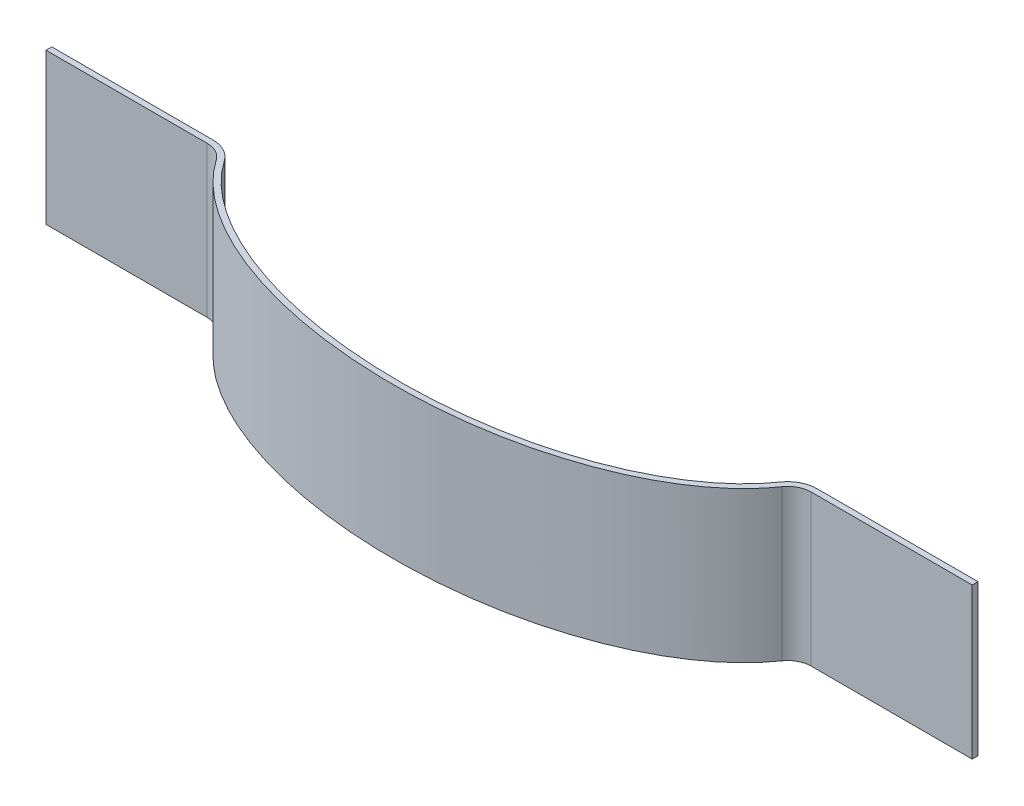
ISO-10303-21;
HEADER;
FILE_DESCRIPTION(('STEP AP214'),'2;1');
FILE_NAME('part.step','',(''),(''),'','','');
FILE_SCHEMA(('AUTOMOTIVE_DESIGN { 1 0 10303 214 1 1 1 1 }'));
ENDSEC;
DATA;
#1=APPLICATION_CONTEXT('core data for automotive mechanical design processes');
#2=APPLICATION_PROTOCOL_DEFINITION('international standard','automotive_design',2000,#1);
#3=PRODUCT_CONTEXT('',#1,'mechanical');
#4=PRODUCT('Part','Part','',(#3));
#5=PRODUCT_RELATED_PRODUCT_CATEGORY('part','',(#4));
#6=PRODUCT_DEFINITION_FORMATION('','',#4);
#7=PRODUCT_DEFINITION_CONTEXT('part definition',#1,'design');
#8=PRODUCT_DEFINITION('design','',#6,#7);
#9=PRODUCT_DEFINITION_SHAPE('','',#8);
#10=(LENGTH_UNIT() NAMED_UNIT(*) SI_UNIT(.MILLI.,.METRE.));
#11=(NAMED_UNIT(*) PLANE_ANGLE_UNIT() SI_UNIT($,.RADIAN.));
#12=(NAMED_UNIT(*) SI_UNIT($,.STERADIAN.) SOLID_ANGLE_UNIT());
#13=UNCERTAINTY_MEASURE_WITH_UNIT(LENGTH_MEASURE(1.E-05),#10,'distance_accuracy_value','');
#14=(GEOMETRIC_REPRESENTATION_CONTEXT(3) GLOBAL_UNCERTAINTY_ASSIGNED_CONTEXT((#13)) GLOBAL_UNIT_ASSIGNED_CONTEXT((#10,
#11,#12)) REPRESENTATION_CONTEXT('',''));
#15=CARTESIAN_POINT('',(0.,0.,0.));
#16=DIRECTION('',(0.,0.,1.));
#17=DIRECTION('',(1.,0.,0.));
#18=AXIS2_PLACEMENT_3D('',#15,#16,#17);
#19=CARTESIAN_POINT('',(16.8897912138371,9.49999999497035,10.9999999950296));
#20=DIRECTION('',(0.,1.,0.));
#21=DIRECTION('',(-1.,0.,0.));
#22=AXIS2_PLACEMENT_3D('',#19,#20,#21);
#23=CYLINDRICAL_SURFACE('',#22,2.);
#24=DIRECTION('',(0.,-1.,0.));
#25=VECTOR('',#24,1.);
#26=CARTESIAN_POINT('',(16.8897912138371,-5.02963642956544E-09,8.99999999502961));
#27=LINE('',#26,#25);
#28=CARTESIAN_POINT('',(16.8897912138371,15.9999999949704,8.99999999502967));
#29=VERTEX_POINT('',#28);
#30=CARTESIAN_POINT('',(16.8897912138371,2.99999999999999,8.99999999502961));
#31=VERTEX_POINT('',#30);
#32=EDGE_CURVE('E223',#29,#31,#27,.T.);
#33=ORIENTED_EDGE('',*,*,#32,.T.);
#34=CARTESIAN_POINT('',(16.8897912138371,2.99999999999999,10.9999999950296));
#35=DIRECTION('',(0.,1.,0.));
#36=DIRECTION('',(-1.,0.,0.));
#37=AXIS2_PLACEMENT_3D('',#34,#35,#36);
#38=CIRCLE('',#37,2.);
#39=CARTESIAN_POINT('',(18.5374581917324,2.99999999999999,9.86633623096491));
#40=VERTEX_POINT('',#39);
#41=EDGE_CURVE('E225',#31,#40,#38,.F.);
#42=ORIENTED_EDGE('',*,*,#41,.T.);
#43=DIRECTION('',(0.,1.,0.));
#44=VECTOR('',#43,1.);
#45=CARTESIAN_POINT('',(18.5374581917217,-5.02965030735325E-09,9.86633623094938));
#46=LINE('',#45,#44);
#47=CARTESIAN_POINT('',(18.5374581917324,15.9999999949704,9.86633623096492));
#48=VERTEX_POINT('',#47);
#49=EDGE_CURVE('E233',#40,#48,#46,.T.);
#50=ORIENTED_EDGE('',*,*,#49,.T.);
#51=CARTESIAN_POINT('',(16.8897912138371,15.9999999949704,10.9999999950297));
#52=DIRECTION('',(0.,-1.,0.));
#53=DIRECTION('',(1.,0.,0.));
#54=AXIS2_PLACEMENT_3D('',#51,#52,#53);
#55=CIRCLE('',#54,2.);
#56=EDGE_CURVE('E227',#48,#29,#55,.F.);
#57=ORIENTED_EDGE('',*,*,#56,.T.);
#58=EDGE_LOOP('',(#33,#42,#50,#57));
#59=FACE_BOUND('',#58,.T.);
#60=ADVANCED_FACE('F36',(#59),#23,.F.);
#61=CARTESIAN_POINT('',(20.91618604,-5.02963642956544E-09,8.99999999502961));
#62=DIRECTION('',(0.,0.,1.));
#63=DIRECTION('',(-1.,0.,0.));
#64=AXIS2_PLACEMENT_3D('',#61,#62,#63);
#65=PLANE('',#64);
#66=DIRECTION('',(-1.,0.,0.));
#67=VECTOR('',#66,1.);
#68=CARTESIAN_POINT('',(20.91618604,2.99999999999999,8.99999999502962));
#69=LINE('',#68,#67);
#70=CARTESIAN_POINT('',(3.,2.99999999999999,8.99999999502964));
#71=VERTEX_POINT('',#70);
#72=EDGE_CURVE('E205',#31,#71,#69,.T.);
#73=ORIENTED_EDGE('',*,*,#72,.F.);
#74=ORIENTED_EDGE('',*,*,#32,.F.);
#75=DIRECTION('',(1.,0.,0.));
#76=VECTOR('',#75,1.);
#77=CARTESIAN_POINT('',(20.91618604,15.9999999949704,8.99999999502967));
#78=LINE('',#77,#76);
#79=CARTESIAN_POINT('',(3.,15.9999999949704,8.99999999502964));
#80=VERTEX_POINT('',#79);
#81=EDGE_CURVE('E58',#80,#29,#78,.T.);
#82=ORIENTED_EDGE('',*,*,#81,.F.);
#83=DIRECTION('',(0.,1.,0.));
#84=VECTOR('',#83,1.);
#85=CARTESIAN_POINT('',(3.,-5.02963523419511E-09,8.99999999502961));
#86=LINE('',#85,#84);
#87=EDGE_CURVE('E43',#71,#80,#86,.T.);
#88=ORIENTED_EDGE('',*,*,#87,.F.);
#89=EDGE_LOOP('',(#73,#74,#82,#88));
#90=FACE_BOUND('',#89,.T.);
#91=ADVANCED_FACE('F213',(#90),#65,.T.);
#92=CARTESIAN_POINT('',(68.9425808661629,9.49999999497035,10.9999999950296));
#93=DIRECTION('',(0.,1.,0.));
#94=DIRECTION('',(-1.,0.,0.));
#95=AXIS2_PLACEMENT_3D('',#92,#93,#94);
#96=CYLINDRICAL_SURFACE('',#95,2.);
#97=DIRECTION('',(0.,1.,0.));
#98=VECTOR('',#97,1.);
#99=CARTESIAN_POINT('',(67.294913888276,-5.02964336845935E-09,9.86633623095261));
#100=LINE('',#99,#98);
#101=CARTESIAN_POINT('',(67.2949138882676,15.9999999949703,9.86633623096491));
#102=VERTEX_POINT('',#101);
#103=CARTESIAN_POINT('',(67.2949138882676,3.,9.86633623096487));
#104=VERTEX_POINT('',#103);
#105=EDGE_CURVE('E229',#102,#104,#100,.F.);
#106=ORIENTED_EDGE('',*,*,#105,.T.);
#107=CARTESIAN_POINT('',(68.9425808661629,3.,10.9999999950296));
#108=DIRECTION('',(0.,1.,0.));
#109=DIRECTION('',(-1.,0.,0.));
#110=AXIS2_PLACEMENT_3D('',#107,#108,#109);
#111=CIRCLE('',#110,2.);
#112=CARTESIAN_POINT('',(68.9425808661629,3.,8.99999999502959));
#113=VERTEX_POINT('',#112);
#114=EDGE_CURVE('E204',#104,#113,#111,.F.);
#115=ORIENTED_EDGE('',*,*,#114,.T.);
#116=DIRECTION('',(0.,-1.,0.));
#117=VECTOR('',#116,1.);
#118=CARTESIAN_POINT('',(68.9425808661629,-5.02963642956544E-09,8.99999999502962));
#119=LINE('',#118,#117);
#120=CARTESIAN_POINT('',(68.9425808661629,15.9999999949703,8.99999999502963));
#121=VERTEX_POINT('',#120);
#122=EDGE_CURVE('E236',#113,#121,#119,.F.);
#123=ORIENTED_EDGE('',*,*,#122,.T.);
#124=CARTESIAN_POINT('',(68.9425808661629,15.9999999949703,10.9999999950296));
#125=DIRECTION('',(0.,-1.,0.));
#126=DIRECTION('',(1.,0.,0.));
#127=AXIS2_PLACEMENT_3D('',#124,#125,#126);
#128=CIRCLE('',#127,2.);
#129=EDGE_CURVE('E183',#121,#102,#128,.F.);
#130=ORIENTED_EDGE('',*,*,#129,.T.);
#131=EDGE_LOOP('',(#106,#115,#123,#130));
#132=FACE_BOUND('',#131,.T.);
#133=ADVANCED_FACE('F218',(#132),#96,.F.);
#134=CARTESIAN_POINT('',(64.91618604,-5.02963642956544E-09,8.99999999502962));
#135=DIRECTION('',(0.,0.,1.));
#136=DIRECTION('',(-1.,0.,0.));
#137=AXIS2_PLACEMENT_3D('',#134,#135,#136);
#138=PLANE('',#137);
#139=DIRECTION('',(-1.,0.,0.));
#140=VECTOR('',#139,1.);
#141=CARTESIAN_POINT('',(64.91618604,3.,8.99999999502963));
#142=LINE('',#141,#140);
#143=CARTESIAN_POINT('',(82.8323720749977,3.,8.99999999502965));
#144=VERTEX_POINT('',#143);
#145=EDGE_CURVE('E297',#144,#113,#142,.T.);
#146=ORIENTED_EDGE('',*,*,#145,.F.);
#147=DIRECTION('',(0.,-1.,0.));
#148=VECTOR('',#147,1.);
#149=CARTESIAN_POINT('',(82.8323720749977,-5.02963642956544E-09,8.99999999502961));
#150=LINE('',#149,#148);
#151=CARTESIAN_POINT('',(82.8323720749977,15.9999999949704,8.99999999502967));
#152=VERTEX_POINT('',#151);
#153=EDGE_CURVE('E11',#152,#144,#150,.T.);
#154=ORIENTED_EDGE('',*,*,#153,.F.);
#155=DIRECTION('',(1.,0.,0.));
#156=VECTOR('',#155,1.);
#157=CARTESIAN_POINT('',(64.91618604,15.9999999949703,8.99999999502967));
#158=LINE('',#157,#156);
#159=EDGE_CURVE('E285',#121,#152,#158,.T.);
#160=ORIENTED_EDGE('',*,*,#159,.F.);
#161=ORIENTED_EDGE('',*,*,#122,.F.);
#162=EDGE_LOOP('',(#146,#154,#160,#161));
#163=FACE_BOUND('',#162,.T.);
#164=ADVANCED_FACE('F191',(#163),#138,.T.);
#165=CARTESIAN_POINT('',(20.91618604,-5.02962255177763E-09,4.99999999502961));
#166=CARTESIAN_POINT('',(20.91618604,-5.02962255177763E-09,5.43203663686933));
#167=CARTESIAN_POINT('',(21.0612996780334,-5.02962255177763E-09,6.29610992054875));
#168=CARTESIAN_POINT('',(21.9187981969256,-5.02963642956544E-09,7.88664464208802));
#169=CARTESIAN_POINT('',(23.6581810932833,-5.02964336845935E-09,9.6693867916077));
#170=CARTESIAN_POINT('',(27.1749338723224,-5.02965030735325E-09,11.9987857519427));
#171=CARTESIAN_POINT('',(33.5518250020295,-5.02965724624715E-09,14.3281522537659));
#172=CARTESIAN_POINT('',(42.91618604,-5.02966418514106E-09,15.3359238656615));
#173=CARTESIAN_POINT('',(52.2805470779705,-5.02966418514106E-09,14.3281522537659));
#174=CARTESIAN_POINT('',(58.6574382076776,-5.02965030735325E-09,11.9987857519427));
#175=CARTESIAN_POINT('',(62.1741909867167,-5.02963642956544E-09,9.6693867916077));
#176=CARTESIAN_POINT('',(63.9135738830744,-5.02963642956544E-09,7.88664464208802));
#177=CARTESIAN_POINT('',(64.7710724019666,-5.02962255177763E-09,6.29610992054875));
#178=CARTESIAN_POINT('',(64.91618604,-5.02962255177763E-09,5.43203663686933));
#179=CARTESIAN_POINT('',(64.91618604,-5.02962255177763E-09,4.99999999502962));
#180=B_SPLINE_CURVE_WITH_KNOTS('',3,(#165,#166,#167,#168,#169,#170,#171,#172,#173,#174,#175,
#176,#177,#178,#179),.UNSPECIFIED.,.F.,.F.,(4,1,1,1,1,1,1,1,1,1,1,1,4),(3.14159265358979,
3.33794219443916,3.53429173528852,3.73064127613788,3.92699081698724,4.31968989868597,
4.71238898038469,5.10508806208341,5.49778714378214,5.6941366846315,5.89048622548086,
6.08683576633022,6.28318530717959),.UNSPECIFIED.);
#181=DIRECTION('',(0.,1.,0.));
#182=VECTOR('',#181,1.);
#183=SURFACE_OF_LINEAR_EXTRUSION('',#180,#182);
#184=OFFSET_SURFACE('',#183,4.,.F.);
#185=CARTESIAN_POINT('',(67.2949138882676,3.,9.86633623096487));
#186=CARTESIAN_POINT('',(67.1684440931066,3.,10.0502030135455));
#187=CARTESIAN_POINT('',(67.0363906796709,3.,10.2301440314707));
#188=CARTESIAN_POINT('',(66.7626468408219,3.,10.5820103308421));
#189=CARTESIAN_POINT('',(66.620974997312,3.,10.7539500441448));
#190=CARTESIAN_POINT('',(66.3291127520982,3.,11.0902550530924));
#191=CARTESIAN_POINT('',(66.1789266630438,3.,11.2546241083053));
#192=CARTESIAN_POINT('',(65.8724313172399,3.,11.5746100408212));
#193=CARTESIAN_POINT('',(65.7161921280537,3.,11.7302941816732));
#194=CARTESIAN_POINT('',(65.3970483231909,3.,12.0348203377828));
#195=CARTESIAN_POINT('',(65.2341405097192,3.,12.1836589960406));
#196=CARTESIAN_POINT('',(64.9023845100024,3.,12.4746420649206));
#197=CARTESIAN_POINT('',(64.7335345581745,3.,12.6167844560413));
#198=CARTESIAN_POINT('',(64.2514464556864,3.,13.0071405144468));
#199=CARTESIAN_POINT('',(63.9321481771395,3.,13.2479047347508));
#200=CARTESIAN_POINT('',(63.2795117624317,3.,13.7097134978813));
#201=CARTESIAN_POINT('',(62.9461676914851,3.,13.9307495794251));
#202=CARTESIAN_POINT('',(62.2679411757094,3.,14.3543866724914));
#203=CARTESIAN_POINT('',(61.9230574555743,3.,14.5569856371685));
#204=CARTESIAN_POINT('',(61.2210471929346,3.,14.9460497469424));
#205=CARTESIAN_POINT('',(60.8638496371084,3.,15.1323862668058));
#206=CARTESIAN_POINT('',(60.1414727278882,3.,15.4886168930814));
#207=CARTESIAN_POINT('',(59.776295065123,3.,15.6585144415647));
#208=CARTESIAN_POINT('',(59.0392700343087,3.,15.9832339756128));
#209=CARTESIAN_POINT('',(58.6674218096528,3.,16.1380540083331));
#210=CARTESIAN_POINT('',(57.7995477412056,3.,16.4803684463789));
#211=CARTESIAN_POINT('',(57.3014785566919,3.,16.6626897441269));
#212=CARTESIAN_POINT('',(56.2975311155487,3.,17.0045725848523));
#213=CARTESIAN_POINT('',(55.7916513731083,3.,17.1641297367609));
#214=CARTESIAN_POINT('',(54.7733151560886,3.,17.4616716407113));
#215=CARTESIAN_POINT('',(54.2608555736741,3.,17.5996457600311));
#216=CARTESIAN_POINT('',(53.4883395046693,3.,17.7909046867859));
#217=CARTESIAN_POINT('',(53.2301992293896,3.,17.8520400335823));
#218=CARTESIAN_POINT('',(52.7127456594417,3.,17.9691327831594));
#219=CARTESIAN_POINT('',(52.4534323617423,3.,18.0250901725522));
#220=CARTESIAN_POINT('',(51.6740585073555,3.,18.1854080267874));
#221=CARTESIAN_POINT('',(51.1524350318748,3.,18.28224593991));
#222=CARTESIAN_POINT('',(50.1060220544663,3.,18.4569080901237));
#223=CARTESIAN_POINT('',(49.5812324335895,3.,18.5347316082456));
#224=CARTESIAN_POINT('',(48.5293945254812,3.,18.6720785690793));
#225=CARTESIAN_POINT('',(48.0023467968509,3.,18.7316062995037));
#226=CARTESIAN_POINT('',(46.9465469458277,3.,18.8328564322404));
#227=CARTESIAN_POINT('',(46.417794836107,3.,18.8745789666297));
#228=CARTESIAN_POINT('',(45.5109740706491,3.,18.9309977924382));
#229=CARTESIAN_POINT('',(45.1331678550092,3.,18.9500130778416));
#230=CARTESIAN_POINT('',(44.3772180544103,3.,18.9791119253451));
#231=CARTESIAN_POINT('',(43.9990744785194,3.,18.9891957206831));
#232=CARTESIAN_POINT('',(43.2426266175703,3.,19.000374274344));
#233=CARTESIAN_POINT('',(42.8643223226806,3.,19.0014683665954));
#234=CARTESIAN_POINT('',(42.1077931008588,3.,18.9946425532552));
#235=CARTESIAN_POINT('',(41.7295681745753,3.,18.9867225766493));
#236=CARTESIAN_POINT('',(40.9733081320334,3.,18.9619440114931));
#237=CARTESIAN_POINT('',(40.5952730923841,3.,18.9450830605258));
#238=CARTESIAN_POINT('',(39.8397210572341,3.,18.9024129697075));
#239=CARTESIAN_POINT('',(39.4622040612316,3.,18.8766038385317));
#240=CARTESIAN_POINT('',(38.3322142249044,3.,18.7858088329513));
#241=CARTESIAN_POINT('',(37.5807477058313,3.,18.7074046774618));
#242=CARTESIAN_POINT('',(36.4573039340414,3.,18.5620741999557));
#243=CARTESIAN_POINT('',(36.0834720531697,3.,18.5090142055376));
#244=CARTESIAN_POINT('',(35.337266261916,3.,18.3933823845907));
#245=CARTESIAN_POINT('',(34.9648923580415,3.,18.3308105156573));
#246=CARTESIAN_POINT('',(34.2220947907623,3.,18.1958780133701));
#247=CARTESIAN_POINT('',(33.8516703253949,2.99999999999999,18.1235217961705));
#248=CARTESIAN_POINT('',(33.1129730195451,2.99999999999999,17.9685575512248));
#249=CARTESIAN_POINT('',(32.7447001364086,2.99999999999999,17.8859497274393));
#250=CARTESIAN_POINT('',(32.0686314967826,2.99999999999999,17.7240461221481));
#251=CARTESIAN_POINT('',(31.7604675275647,2.99999999999999,17.6462866528733));
#252=CARTESIAN_POINT('',(31.1461648461952,2.99999999999999,17.4831656550781));
#253=CARTESIAN_POINT('',(30.8400261260857,2.99999999999999,17.3978041564476));
#254=CARTESIAN_POINT('',(29.9250030969704,2.99999999999999,17.1300491601522));
#255=CARTESIAN_POINT('',(29.3194857725492,2.99999999999999,16.9359789373812));
#256=CARTESIAN_POINT('',(28.1193664685582,2.99999999999999,16.5144629301057));
#257=CARTESIAN_POINT('',(27.5247766758037,2.99999999999999,16.2869821580386));
#258=CARTESIAN_POINT('',(26.6444219391632,2.99999999999999,15.9184749630105));
#259=CARTESIAN_POINT('',(26.3529043883624,2.99999999999999,15.7910976627161));
#260=CARTESIAN_POINT('',(25.7742809160311,2.99999999999999,15.5266732937783));
#261=CARTESIAN_POINT('',(25.4871747874601,2.99999999999999,15.3896266806417));
#262=CARTESIAN_POINT('',(24.986079454977,2.99999999999999,15.1391845810809));
#263=CARTESIAN_POINT('',(24.7710047073359,2.99999999999999,15.0279579324538));
#264=CARTESIAN_POINT('',(24.3442429945969,2.99999999999999,14.7991804642747));
#265=CARTESIAN_POINT('',(24.1325559720853,2.99999999999999,14.681629752048));
#266=CARTESIAN_POINT('',(23.7128984861939,2.99999999999999,14.4399850157551));
#267=CARTESIAN_POINT('',(23.5049286546783,2.99999999999999,14.3158898931417));
#268=CARTESIAN_POINT('',(23.0931650592438,2.99999999999999,14.0609468096725));
#269=CARTESIAN_POINT('',(22.8893713121394,2.99999999999999,13.9300988216346));
#270=CARTESIAN_POINT('',(22.4874086234861,2.99999999999999,13.6620019360083));
#271=CARTESIAN_POINT('',(22.2892176950368,2.99999999999999,13.524786120459));
#272=CARTESIAN_POINT('',(21.8980811661594,2.99999999999999,13.2430954268313));
#273=CARTESIAN_POINT('',(21.7051357015843,2.99999999999999,13.0986203610198));
#274=CARTESIAN_POINT('',(21.1354199303817,2.99999999999999,12.6537953527266));
#275=CARTESIAN_POINT('',(20.767475547945,2.99999999999999,12.3418515561697));
#276=CARTESIAN_POINT('',(20.2409300098414,2.99999999999999,11.8517608390854));
#277=CARTESIAN_POINT('',(20.0707403664345,2.99999999999999,11.6859289569286));
#278=CARTESIAN_POINT('',(19.738792765326,2.99999999999999,11.346097215661));
#279=CARTESIAN_POINT('',(19.5770319678337,2.99999999999999,11.1721001455553));
#280=CARTESIAN_POINT('',(19.2623123002156,2.99999999999999,10.8147341263391));
#281=CARTESIAN_POINT('',(19.1094014988301,2.99999999999999,10.6313226567127));
#282=CARTESIAN_POINT('',(18.8146771516958,2.99999999999999,10.2555603950001));
#283=CARTESIAN_POINT('',(18.6728729416345,2.99999999999999,10.0632022947002));
#284=CARTESIAN_POINT('',(18.5374581917324,2.99999999999999,9.86633623096489));
#285=B_SPLINE_CURVE_WITH_KNOTS('',3,(#185,#186,#187,#188,#189,#190,#191,#192,#193,#194,#195,
#196,#197,#198,#199,#200,#201,#202,#203,#204,#205,#206,#207,#208,#209,#210,#211,#212,#213,#214,
#215,#216,#217,#218,#219,#220,#221,#222,#223,#224,#225,#226,#227,#228,#229,#230,#231,#232,#233,
#234,#235,#236,#237,#238,#239,#240,#241,#242,#243,#244,#245,#246,#247,#248,#249,#250,#251,#252,
#253,#254,#255,#256,#257,#258,#259,#260,#261,#262,#263,#264,#265,#266,#267,#268,#269,#270,#271,
#272,#273,#274,#275,#276,#277,#278,#279,#280,#281,#282,#283,#284),.UNSPECIFIED.,.F.,.F.,(4,2,2,
2,2,2,2,2,2,2,2,2,2,2,2,2,2,2,2,2,2,2,2,2,2,2,2,2,2,2,2,2,2,2,2,2,2,2,2,2,2,2,2,2,2,2,2,2,2,4),
(0.,0.669281806984418,1.33730552325058,2.00499384289205,2.66646274120828,3.32825263621456,
3.99024085666846,5.18901225671086,6.38829535658677,7.58771143603576,8.79588651027868,
10.003808061059,11.211885854719,12.8024289014461,14.3932783408854,15.9849090490023,
16.7807068771558,17.5765067628298,19.1677083788796,20.7589701518634,22.349858719549,
23.9407354859981,25.0754911165634,26.210217113122,27.3450271838467,28.4798461948418,
29.6149652014029,30.7500831074906,33.0156563363389,34.1483005989663,35.2809499111618,
36.4130896992206,37.5452069664283,38.4985792432365,39.4519477717131,41.3586042894407,
43.2672718873329,44.2215230770731,45.1757293434572,45.9020350132949,46.6283283609372,
47.3547440149406,48.0811625931855,48.8041567891258,49.5271696922066,50.9721395653798,
51.6847852079455,52.3971891772918,53.1131561977558,53.8297187086723),.UNSPECIFIED.);
#286=EDGE_CURVE('E198',#104,#40,#285,.T.);
#287=ORIENTED_EDGE('',*,*,#286,.F.);
#288=ORIENTED_EDGE('',*,*,#105,.F.);
#289=CARTESIAN_POINT('',(18.5374581917324,15.9999999949704,9.86633623096493));
#290=CARTESIAN_POINT('',(18.6639279868934,15.9999999949704,10.0502030135455));
#291=CARTESIAN_POINT('',(18.7959814003291,15.9999999949704,10.2301440314708));
#292=CARTESIAN_POINT('',(19.0697252391781,15.9999999949704,10.5820103308422));
#293=CARTESIAN_POINT('',(19.211397082688,15.9999999949704,10.7539500441449));
#294=CARTESIAN_POINT('',(19.5032593279019,15.9999999949704,11.0902550530925));
#295=CARTESIAN_POINT('',(19.6534454169562,15.9999999949704,11.2546241083054));
#296=CARTESIAN_POINT('',(19.9599407627601,15.9999999949704,11.5746100408213));
#297=CARTESIAN_POINT('',(20.1161799519464,15.9999999949704,11.7302941816733));
#298=CARTESIAN_POINT('',(20.4353237568092,15.9999999949704,12.0348203377829));
#299=CARTESIAN_POINT('',(20.5982315702808,15.9999999949704,12.1836589960407));
#300=CARTESIAN_POINT('',(20.9299875699977,15.9999999949704,12.4746420649207));
#301=CARTESIAN_POINT('',(21.0988375218255,15.9999999949704,12.6167844560414));
#302=CARTESIAN_POINT('',(21.5809256243136,15.9999999949704,13.0071405144469));
#303=CARTESIAN_POINT('',(21.9002239028605,15.9999999949704,13.2479047347509));
#304=CARTESIAN_POINT('',(22.5528603175683,15.9999999949704,13.7097134978814));
#305=CARTESIAN_POINT('',(22.8862043885149,15.9999999949704,13.9307495794252));
#306=CARTESIAN_POINT('',(23.5644309042907,15.9999999949704,14.3543866724915));
#307=CARTESIAN_POINT('',(23.9093146244258,15.9999999949704,14.5569856371686));
#308=CARTESIAN_POINT('',(24.6113248870654,15.9999999949704,14.9460497469425));
#309=CARTESIAN_POINT('',(24.9685224428917,15.9999999949704,15.1323862668059));
#310=CARTESIAN_POINT('',(25.6908993521119,15.9999999949704,15.4886168930815));
#311=CARTESIAN_POINT('',(26.0560770148771,15.9999999949704,15.6585144415648));
#312=CARTESIAN_POINT('',(26.7931020456914,15.9999999949704,15.9832339756129));
#313=CARTESIAN_POINT('',(27.1649502703472,15.9999999949704,16.1380540083331));
#314=CARTESIAN_POINT('',(28.0328243387945,15.9999999949704,16.480368446379));
#315=CARTESIAN_POINT('',(28.5308935233082,15.9999999949704,16.662689744127));
#316=CARTESIAN_POINT('',(29.5348409644515,15.9999999949704,17.0045725848524));
#317=CARTESIAN_POINT('',(30.0407207068918,15.9999999949704,17.164129736761));
#318=CARTESIAN_POINT('',(31.0590569239116,15.9999999949704,17.4616716407113));
#319=CARTESIAN_POINT('',(31.571516506326,15.9999999949704,17.5996457600312));
#320=CARTESIAN_POINT('',(32.3440325753309,15.9999999949704,17.790904686786));
#321=CARTESIAN_POINT('',(32.6021728506105,15.9999999949704,17.8520400335823));
#322=CARTESIAN_POINT('',(33.1196264205585,15.9999999949704,17.9691327831594));
#323=CARTESIAN_POINT('',(33.3789397182578,15.9999999949704,18.0250901725523));
#324=CARTESIAN_POINT('',(34.1583135726446,15.9999999949704,18.1854080267875));
#325=CARTESIAN_POINT('',(34.6799370481254,15.9999999949704,18.2822459399101));
#326=CARTESIAN_POINT('',(35.7263500255338,15.9999999949704,18.4569080901238));
#327=CARTESIAN_POINT('',(36.2511396464107,15.9999999949704,18.5347316082457));
#328=CARTESIAN_POINT('',(37.302977554519,15.9999999949704,18.6720785690793));
#329=CARTESIAN_POINT('',(37.8300252831492,15.9999999949704,18.7316062995037));
#330=CARTESIAN_POINT('',(38.8858251341724,15.9999999949704,18.8328564322405));
#331=CARTESIAN_POINT('',(39.4145772438932,15.9999999949704,18.8745789666298));
#332=CARTESIAN_POINT('',(40.3213980093511,15.9999999949704,18.9309977924382));
#333=CARTESIAN_POINT('',(40.699204224991,15.9999999949704,18.9500130778417));
#334=CARTESIAN_POINT('',(41.4551540255898,15.9999999949704,18.9791119253451));
#335=CARTESIAN_POINT('',(41.8332976014808,15.9999999949704,18.9891957206831));
#336=CARTESIAN_POINT('',(42.5897454624299,15.9999999949704,19.000374274344));
#337=CARTESIAN_POINT('',(42.9680497573195,15.9999999949704,19.0014683665955));
#338=CARTESIAN_POINT('',(43.7245789791414,15.9999999949704,18.9946425532552));
#339=CARTESIAN_POINT('',(44.1028039054249,15.9999999949704,18.9867225766493));
#340=CARTESIAN_POINT('',(44.8590639479668,15.9999999949704,18.9619440114932));
#341=CARTESIAN_POINT('',(45.2370989876162,15.9999999949704,18.9450830605258));
#342=CARTESIAN_POINT('',(45.9926510227661,15.9999999949704,18.9024129697075));
#343=CARTESIAN_POINT('',(46.3701680187686,15.9999999949704,18.8766038385317));
#344=CARTESIAN_POINT('',(47.5001578550959,15.9999999949704,18.7858088329513));
#345=CARTESIAN_POINT('',(48.251624374169,15.9999999949704,18.7074046774618));
#346=CARTESIAN_POINT('',(49.3750681459588,15.9999999949704,18.5620741999557));
#347=CARTESIAN_POINT('',(49.7489000268305,15.9999999949704,18.5090142055376));
#348=CARTESIAN_POINT('',(50.4951058180842,15.9999999949704,18.3933823845907));
#349=CARTESIAN_POINT('',(50.8674797219588,15.9999999949704,18.3308105156573));
#350=CARTESIAN_POINT('',(51.6102772892379,15.9999999949704,18.1958780133701));
#351=CARTESIAN_POINT('',(51.9807017546054,15.9999999949704,18.1235217961705));
#352=CARTESIAN_POINT('',(52.7193990604552,15.9999999949704,17.9685575512247));
#353=CARTESIAN_POINT('',(53.0876719435916,15.9999999949704,17.8859497274392));
#354=CARTESIAN_POINT('',(53.7637405832177,15.9999999949704,17.7240461221481));
#355=CARTESIAN_POINT('',(54.0719045524356,15.9999999949704,17.6462866528732));
#356=CARTESIAN_POINT('',(54.6862072338051,15.9999999949704,17.483165655078));
#357=CARTESIAN_POINT('',(54.9923459539146,15.9999999949703,17.3978041564475));
#358=CARTESIAN_POINT('',(55.9073689830299,15.9999999949703,17.1300491601521));
#359=CARTESIAN_POINT('',(56.5128863074511,15.9999999949703,16.9359789373812));
#360=CARTESIAN_POINT('',(57.7130056114421,15.9999999949703,16.5144629301056));
#361=CARTESIAN_POINT('',(58.3075954041965,15.9999999949703,16.2869821580385));
#362=CARTESIAN_POINT('',(59.1879501408371,15.9999999949703,15.9184749630104));
#363=CARTESIAN_POINT('',(59.4794676916379,15.9999999949703,15.791097662716));
#364=CARTESIAN_POINT('',(60.0580911639692,15.9999999949703,15.5266732937782));
#365=CARTESIAN_POINT('',(60.3451972925402,15.9999999949703,15.3896266806416));
#366=CARTESIAN_POINT('',(60.8462926250233,15.9999999949703,15.1391845810808));
#367=CARTESIAN_POINT('',(61.0613673726644,15.9999999949703,15.0279579324537));
#368=CARTESIAN_POINT('',(61.4881290854034,15.9999999949703,14.7991804642746));
#369=CARTESIAN_POINT('',(61.699816107915,15.9999999949703,14.6816297520478));
#370=CARTESIAN_POINT('',(62.1194735938064,15.9999999949703,14.439985015755));
#371=CARTESIAN_POINT('',(62.3274434253219,15.9999999949703,14.3158898931415));
#372=CARTESIAN_POINT('',(62.7392070207564,15.9999999949703,14.0609468096723));
#373=CARTESIAN_POINT('',(62.9430007678608,15.9999999949703,13.9300988216345));
#374=CARTESIAN_POINT('',(63.3449634565141,15.9999999949703,13.6620019360082));
#375=CARTESIAN_POINT('',(63.5431543849634,15.9999999949703,13.5247861204589));
#376=CARTESIAN_POINT('',(63.9342909138408,15.9999999949703,13.2430954268311));
#377=CARTESIAN_POINT('',(64.1272363784159,15.9999999949703,13.0986203610196));
#378=CARTESIAN_POINT('',(64.6969521496185,15.9999999949703,12.6537953527265));
#379=CARTESIAN_POINT('',(65.0648965320551,15.9999999949703,12.3418515561695));
#380=CARTESIAN_POINT('',(65.5914420701588,15.9999999949703,11.8517608390852));
#381=CARTESIAN_POINT('',(65.7616317135656,15.9999999949703,11.6859289569285));
#382=CARTESIAN_POINT('',(66.0935793146741,15.9999999949703,11.3460972156609));
#383=CARTESIAN_POINT('',(66.2553401121664,15.9999999949703,11.1721001455552));
#384=CARTESIAN_POINT('',(66.5700597797844,15.9999999949703,10.814734126339));
#385=CARTESIAN_POINT('',(66.7229705811699,15.9999999949703,10.6313226567127));
#386=CARTESIAN_POINT('',(67.0176949283042,15.9999999949703,10.2555603950002));
#387=CARTESIAN_POINT('',(67.1594991383654,15.9999999949703,10.0632022947002));
#388=CARTESIAN_POINT('',(67.2949138882676,15.9999999949703,9.86633623096498));
#389=B_SPLINE_CURVE_WITH_KNOTS('',3,(#289,#290,#291,#292,#293,#294,#295,#296,#297,#298,#299,
#300,#301,#302,#303,#304,#305,#306,#307,#308,#309,#310,#311,#312,#313,#314,#315,#316,#317,#318,
#319,#320,#321,#322,#323,#324,#325,#326,#327,#328,#329,#330,#331,#332,#333,#334,#335,#336,#337,
#338,#339,#340,#341,#342,#343,#344,#345,#346,#347,#348,#349,#350,#351,#352,#353,#354,#355,#356,
#357,#358,#359,#360,#361,#362,#363,#364,#365,#366,#367,#368,#369,#370,#371,#372,#373,#374,#375,
#376,#377,#378,#379,#380,#381,#382,#383,#384,#385,#386,#387,#388),.UNSPECIFIED.,.F.,.F.,(4,2,2,
2,2,2,2,2,2,2,2,2,2,2,2,2,2,2,2,2,2,2,2,2,2,2,2,2,2,2,2,2,2,2,2,2,2,2,2,2,2,2,2,2,2,2,2,2,2,4),
(0.,0.66928180698443,1.33730552325061,2.00499384289208,2.66646274120832,3.32825263621462,
3.99024085666853,5.18901225671091,6.38829535658684,7.58771143603583,8.79588651027875,
10.0038080610591,11.2118858547191,12.8024289014462,14.3932783408855,15.9849090490024,
16.780706877156,17.5765067628299,19.1677083788798,20.7589701518636,22.3498587195491,
23.9407354859983,25.0754911165636,26.2102171131222,27.3450271838469,28.479846194842,
29.6149652014032,30.7500831074908,33.0156563363391,34.1483005989665,35.2809499111621,
36.4130896992208,37.5452069664286,38.4985792432368,39.4519477717134,41.358604289441,
43.2672718873332,44.2215230770734,45.1757293434575,45.9020350132952,46.6283283609375,
47.3547440149409,48.0811625931857,48.8041567891261,49.5271696922068,50.97213956538,
51.6847852079457,52.3971891772919,53.1131561977558,53.8297187086723),.UNSPECIFIED.);
#390=EDGE_CURVE('E176',#48,#102,#389,.T.);
#391=ORIENTED_EDGE('',*,*,#390,.F.);
#392=ORIENTED_EDGE('',*,*,#49,.F.);
#393=EDGE_LOOP('',(#287,#288,#391,#392));
#394=FACE_BOUND('',#393,.T.);
#395=ADVANCED_FACE('F186',(#394),#184,.T.);
#396=CARTESIAN_POINT('',(82.8323720749977,15.9999999949704,4.99999999502958));
#397=DIRECTION('',(-1.,0.,0.));
#398=DIRECTION('',(0.,0.,1.));
#399=AXIS2_PLACEMENT_3D('',#396,#397,#398);
#400=PLANE('',#399);
#401=DIRECTION('',(0.,0.,-1.));
#402=VECTOR('',#401,1.);
#403=CARTESIAN_POINT('',(82.8323720749977,3.,4.99999999502958));
#404=LINE('',#403,#402);
#405=CARTESIAN_POINT('',(82.8323720749977,3.,8.49999999502965));
#406=VERTEX_POINT('',#405);
#407=EDGE_CURVE('E251',#144,#406,#404,.T.);
#408=ORIENTED_EDGE('',*,*,#407,.T.);
#409=DIRECTION('',(0.,-1.,0.));
#410=VECTOR('',#409,1.);
#411=CARTESIAN_POINT('',(82.8323720749977,15.9999999949704,8.49999999502965));
#412=LINE('',#411,#410);
#413=CARTESIAN_POINT('',(82.8323720749977,15.9999999949704,8.49999999502965));
#414=VERTEX_POINT('',#413);
#415=EDGE_CURVE('E265',#414,#406,#412,.T.);
#416=ORIENTED_EDGE('',*,*,#415,.F.);
#417=DIRECTION('',(0.,0.,-1.));
#418=VECTOR('',#417,1.);
#419=CARTESIAN_POINT('',(82.8323720749977,15.9999999949704,4.99999999502958));
#420=LINE('',#419,#418);
#421=EDGE_CURVE('E249',#152,#414,#420,.T.);
#422=ORIENTED_EDGE('',*,*,#421,.F.);
#423=ORIENTED_EDGE('',*,*,#153,.T.);
#424=EDGE_LOOP('',(#408,#416,#422,#423));
#425=FACE_BOUND('',#424,.T.);
#426=ADVANCED_FACE('F169',(#425),#400,.F.);
#427=CARTESIAN_POINT('',(3.,2.99999999999999,4.99999999502958));
#428=DIRECTION('',(1.,0.,0.));
#429=DIRECTION('',(0.,1.,0.));
#430=AXIS2_PLACEMENT_3D('',#427,#428,#429);
#431=PLANE('',#430);
#432=DIRECTION('',(0.,0.,-1.));
#433=VECTOR('',#432,1.);
#434=CARTESIAN_POINT('',(3.,15.9999999949704,4.99999999502958));
#435=LINE('',#434,#433);
#436=CARTESIAN_POINT('',(3.,15.9999999949704,8.49999999502963));
#437=VERTEX_POINT('',#436);
#438=EDGE_CURVE('E243',#80,#437,#435,.T.);
#439=ORIENTED_EDGE('',*,*,#438,.T.);
#440=DIRECTION('',(0.,-1.,0.));
#441=VECTOR('',#440,1.);
#442=CARTESIAN_POINT('',(3.,15.9999999949704,8.49999999502963));
#443=LINE('',#442,#441);
#444=CARTESIAN_POINT('',(3.,2.99999999999999,8.49999999502963));
#445=VERTEX_POINT('',#444);
#446=EDGE_CURVE('E263',#437,#445,#443,.T.);
#447=ORIENTED_EDGE('',*,*,#446,.T.);
#448=DIRECTION('',(0.,0.,-1.));
#449=VECTOR('',#448,1.);
#450=CARTESIAN_POINT('',(3.,2.99999999999999,4.99999999502958));
#451=LINE('',#450,#449);
#452=EDGE_CURVE('E245',#71,#445,#451,.T.);
#453=ORIENTED_EDGE('',*,*,#452,.F.);
#454=ORIENTED_EDGE('',*,*,#87,.T.);
#455=EDGE_LOOP('',(#439,#447,#453,#454));
#456=FACE_BOUND('',#455,.T.);
#457=ADVANCED_FACE('F165',(#456),#431,.F.);
#458=CARTESIAN_POINT('',(82.8323720749977,3.,4.99999999502958));
#459=DIRECTION('',(0.,1.,0.));
#460=DIRECTION('',(-1.,0.,0.));
#461=AXIS2_PLACEMENT_3D('',#458,#459,#460);
#462=PLANE('',#461);
#463=CARTESIAN_POINT('',(68.9425808661629,3.,10.9999999950296));
#464=DIRECTION('',(0.,-1.,0.));
#465=DIRECTION('',(1.,0.,0.));
#466=AXIS2_PLACEMENT_3D('',#463,#464,#465);
#467=CIRCLE('',#466,2.5);
#468=CARTESIAN_POINT('',(66.8829971437937,3.,9.58292028994871));
#469=VERTEX_POINT('',#468);
#470=CARTESIAN_POINT('',(68.9425808661629,3.,8.49999999502959));
#471=VERTEX_POINT('',#470);
#472=EDGE_CURVE('E130',#469,#471,#467,.T.);
#473=ORIENTED_EDGE('',*,*,#472,.T.);
#474=DIRECTION('',(-1.,0.,0.));
#475=VECTOR('',#474,1.);
#476=CARTESIAN_POINT('',(0.,2.99999999999999,8.49999999502933));
#477=LINE('',#476,#475);
#478=EDGE_CURVE('E143',#406,#471,#477,.T.);
#479=ORIENTED_EDGE('',*,*,#478,.F.);
#480=ORIENTED_EDGE('',*,*,#407,.F.);
#481=ORIENTED_EDGE('',*,*,#145,.T.);
#482=ORIENTED_EDGE('',*,*,#114,.F.);
#483=ORIENTED_EDGE('',*,*,#286,.T.);
#484=ORIENTED_EDGE('',*,*,#41,.F.);
#485=ORIENTED_EDGE('',*,*,#72,.T.);
#486=ORIENTED_EDGE('',*,*,#452,.T.);
#487=DIRECTION('',(-1.,0.,0.));
#488=VECTOR('',#487,1.);
#489=CARTESIAN_POINT('',(0.,2.99999999999999,8.49999999502965));
#490=LINE('',#489,#488);
#491=CARTESIAN_POINT('',(16.8897912138371,2.99999999999999,8.4999999950296));
#492=VERTEX_POINT('',#491);
#493=EDGE_CURVE('E146',#492,#445,#490,.T.);
#494=ORIENTED_EDGE('',*,*,#493,.F.);
#495=CARTESIAN_POINT('',(16.8897912138371,2.99999999999999,10.9999999950296));
#496=DIRECTION('',(0.,-1.,0.));
#497=DIRECTION('',(1.,0.,0.));
#498=AXIS2_PLACEMENT_3D('',#495,#496,#497);
#499=CIRCLE('',#498,2.5);
#500=CARTESIAN_POINT('',(18.9493749362062,2.99999999999999,9.58292028994872));
#501=VERTEX_POINT('',#500);
#502=EDGE_CURVE('E269',#492,#501,#499,.T.);
#503=ORIENTED_EDGE('',*,*,#502,.T.);
#504=CARTESIAN_POINT('',(66.8829971437938,3.,9.58292028994865));
#505=CARTESIAN_POINT('',(66.6640405457616,3.,9.90115182173591));
#506=CARTESIAN_POINT('',(66.4205223129243,3.,10.2171166621244));
#507=CARTESIAN_POINT('',(65.8914955136253,3.,10.8356439081943));
#508=CARTESIAN_POINT('',(65.6053583661094,3.,11.1394700369024));
#509=CARTESIAN_POINT('',(64.6808552931797,3.,12.0360686807721));
#510=CARTESIAN_POINT('',(63.973018379961,3.,12.615273483214));
#511=CARTESIAN_POINT('',(62.7938725266401,3.,13.4352374323092));
#512=CARTESIAN_POINT('',(62.38091916805,3.,13.7010368660071));
#513=CARTESIAN_POINT('',(61.5158325543842,3.,14.2163598780899));
#514=CARTESIAN_POINT('',(61.0628093285321,3.,14.4662045142044));
#515=CARTESIAN_POINT('',(59.6543654927817,3.,15.1846452890459));
#516=CARTESIAN_POINT('',(58.6496102301026,3.,15.6235806900843));
#517=CARTESIAN_POINT('',(56.5251643621469,3.,16.4189960426261));
#518=CARTESIAN_POINT('',(55.405522386278,3.,16.7752562763824));
#519=CARTESIAN_POINT('',(53.0714127898418,3.,17.3941998060842));
#520=CARTESIAN_POINT('',(51.855823356833,3.,17.6558783955909));
#521=CARTESIAN_POINT('',(48.1278438079362,3.,18.2841074315649));
#522=CARTESIAN_POINT('',(45.5264207754134,3.,18.4999999950296));
#523=CARTESIAN_POINT('',(40.3059513045867,3.,18.4999999950296));
#524=CARTESIAN_POINT('',(37.7045282720638,2.99999999999999,18.2841074315649));
#525=CARTESIAN_POINT('',(33.976548723167,2.99999999999999,17.6558783955909));
#526=CARTESIAN_POINT('',(32.7609592901583,2.99999999999999,17.3941998060842));
#527=CARTESIAN_POINT('',(30.426849693722,2.99999999999999,16.7752562763824));
#528=CARTESIAN_POINT('',(29.3072077178532,2.99999999999999,16.4189960426261));
#529=CARTESIAN_POINT('',(27.1827618498975,2.99999999999999,15.6235806900843));
#530=CARTESIAN_POINT('',(26.1780065872183,2.99999999999999,15.1846452890459));
#531=CARTESIAN_POINT('',(24.7695627514679,2.99999999999999,14.4662045142044));
#532=CARTESIAN_POINT('',(24.3165395256158,2.99999999999999,14.2163598780899));
#533=CARTESIAN_POINT('',(23.4514529119501,2.99999999999999,13.7010368660072));
#534=CARTESIAN_POINT('',(23.03849955336,2.99999999999999,13.4352374323093));
#535=CARTESIAN_POINT('',(21.859353700039,2.99999999999999,12.615273483214));
#536=CARTESIAN_POINT('',(21.1515167868203,2.99999999999999,12.0360686807721));
#537=CARTESIAN_POINT('',(20.2270137138906,2.99999999999999,11.1394700369024));
#538=CARTESIAN_POINT('',(19.9408765663748,2.99999999999999,10.8356439081944));
#539=CARTESIAN_POINT('',(19.4118497670758,2.99999999999999,10.2171166621245));
#540=CARTESIAN_POINT('',(19.1683315342384,2.99999999999999,9.90115182173595));
#541=CARTESIAN_POINT('',(18.9493749362062,2.99999999999999,9.5829202899487));
#542=B_SPLINE_CURVE_WITH_KNOTS('',3,(#504,#505,#506,#507,#508,#509,#510,#511,#512,#513,#514,
#515,#516,#517,#518,#519,#520,#521,#522,#523,#524,#525,#526,#527,#528,#529,#530,#531,#532,#533,
#534,#535,#536,#537,#538,#539,#540,#541),.UNSPECIFIED.,.F.,.F.,(4,2,2,2,2,2,2,2,2,2,2,2,2,2,2,2,
2,2,4),(0.,0.0312499999999999,0.0624999999999998,0.125,0.156249999999999,0.187499999999999,
0.249999999999999,0.312499999999999,0.374999999999999,0.499999999999999,0.624999999999999,
0.687499999999999,0.749999999999999,0.812499999999999,0.843749999999999,0.875,0.9375,0.96875,
1.),.UNSPECIFIED.);
#543=EDGE_CURVE('E272',#469,#501,#542,.T.);
#544=ORIENTED_EDGE('',*,*,#543,.F.);
#545=EDGE_LOOP('',(#473,#479,#480,#481,#482,#483,#484,#485,#486,#494,#503,#544));
#546=FACE_BOUND('',#545,.T.);
#547=ADVANCED_FACE('F168',(#546),#462,.F.);
#548=CARTESIAN_POINT('',(3.,15.9999999949704,4.99999999502958));
#549=DIRECTION('',(0.,-1.,0.));
#550=DIRECTION('',(1.,0.,0.));
#551=AXIS2_PLACEMENT_3D('',#548,#549,#550);
#552=PLANE('',#551);
#553=ORIENTED_EDGE('',*,*,#421,.T.);
#554=DIRECTION('',(-1.,0.,0.));
#555=VECTOR('',#554,1.);
#556=CARTESIAN_POINT('',(0.,15.9999999949704,8.49999999502933));
#557=LINE('',#556,#555);
#558=CARTESIAN_POINT('',(68.9425808661629,15.9999999949704,8.49999999502959));
#559=VERTEX_POINT('',#558);
#560=EDGE_CURVE('E132',#414,#559,#557,.T.);
#561=ORIENTED_EDGE('',*,*,#560,.T.);
#562=CARTESIAN_POINT('',(68.9425808661629,15.9999999949704,10.9999999950296));
#563=DIRECTION('',(0.,-1.,0.));
#564=DIRECTION('',(1.,0.,0.));
#565=AXIS2_PLACEMENT_3D('',#562,#563,#564);
#566=CIRCLE('',#565,2.5);
#567=CARTESIAN_POINT('',(66.8829971437937,15.9999999949704,9.58292028994871));
#568=VERTEX_POINT('',#567);
#569=EDGE_CURVE('E127',#568,#559,#566,.T.);
#570=ORIENTED_EDGE('',*,*,#569,.F.);
#571=CARTESIAN_POINT('',(66.8829971437938,15.9999999949704,9.58292028994865));
#572=CARTESIAN_POINT('',(66.6640405457616,15.9999999949704,9.90115182173591));
#573=CARTESIAN_POINT('',(66.4205223129243,15.9999999949704,10.2171166621244));
#574=CARTESIAN_POINT('',(65.8914955136253,15.9999999949704,10.8356439081943));
#575=CARTESIAN_POINT('',(65.6053583661094,15.9999999949704,11.1394700369024));
#576=CARTESIAN_POINT('',(64.6808552931797,15.9999999949704,12.0360686807721));
#577=CARTESIAN_POINT('',(63.973018379961,15.9999999949704,12.615273483214));
#578=CARTESIAN_POINT('',(62.7938725266401,15.9999999949704,13.4352374323092));
#579=CARTESIAN_POINT('',(62.38091916805,15.9999999949704,13.7010368660071));
#580=CARTESIAN_POINT('',(61.5158325543842,15.9999999949704,14.2163598780899));
#581=CARTESIAN_POINT('',(61.0628093285321,15.9999999949704,14.4662045142044));
#582=CARTESIAN_POINT('',(59.6543654927817,15.9999999949704,15.1846452890459));
#583=CARTESIAN_POINT('',(58.6496102301026,15.9999999949704,15.6235806900843));
#584=CARTESIAN_POINT('',(56.5251643621469,15.9999999949704,16.4189960426261));
#585=CARTESIAN_POINT('',(55.405522386278,15.9999999949704,16.7752562763824));
#586=CARTESIAN_POINT('',(53.0714127898418,15.9999999949704,17.3941998060842));
#587=CARTESIAN_POINT('',(51.855823356833,15.9999999949704,17.6558783955909));
#588=CARTESIAN_POINT('',(48.1278438079362,15.9999999949704,18.2841074315649));
#589=CARTESIAN_POINT('',(45.5264207754134,15.9999999949704,18.4999999950296));
#590=CARTESIAN_POINT('',(40.3059513045867,15.9999999949704,18.4999999950296));
#591=CARTESIAN_POINT('',(37.7045282720638,15.9999999949704,18.2841074315649));
#592=CARTESIAN_POINT('',(33.976548723167,15.9999999949704,17.6558783955909));
#593=CARTESIAN_POINT('',(32.7609592901583,15.9999999949704,17.3941998060842));
#594=CARTESIAN_POINT('',(30.426849693722,15.9999999949704,16.7752562763824));
#595=CARTESIAN_POINT('',(29.3072077178532,15.9999999949704,16.4189960426261));
#596=CARTESIAN_POINT('',(27.1827618498974,15.9999999949704,15.6235806900843));
#597=CARTESIAN_POINT('',(26.1780065872183,15.9999999949704,15.1846452890459));
#598=CARTESIAN_POINT('',(24.7695627514679,15.9999999949704,14.4662045142044));
#599=CARTESIAN_POINT('',(24.3165395256158,15.9999999949704,14.2163598780899));
#600=CARTESIAN_POINT('',(23.4514529119501,15.9999999949704,13.7010368660072));
#601=CARTESIAN_POINT('',(23.03849955336,15.9999999949704,13.4352374323093));
#602=CARTESIAN_POINT('',(21.859353700039,15.9999999949704,12.615273483214));
#603=CARTESIAN_POINT('',(21.1515167868203,15.9999999949704,12.0360686807721));
#604=CARTESIAN_POINT('',(20.2270137138906,15.9999999949704,11.1394700369024));
#605=CARTESIAN_POINT('',(19.9408765663748,15.9999999949704,10.8356439081944));
#606=CARTESIAN_POINT('',(19.4118497670758,15.9999999949704,10.2171166621245));
#607=CARTESIAN_POINT('',(19.1683315342384,15.9999999949704,9.90115182173595));
#608=CARTESIAN_POINT('',(18.9493749362062,15.9999999949704,9.5829202899487));
#609=B_SPLINE_CURVE_WITH_KNOTS('',3,(#571,#572,#573,#574,#575,#576,#577,#578,#579,#580,#581,
#582,#583,#584,#585,#586,#587,#588,#589,#590,#591,#592,#593,#594,#595,#596,#597,#598,#599,#600,
#601,#602,#603,#604,#605,#606,#607,#608),.UNSPECIFIED.,.F.,.F.,(4,2,2,2,2,2,2,2,2,2,2,2,2,2,2,2,
2,2,4),(0.,0.0312499999999999,0.0624999999999998,0.125,0.156249999999999,0.187499999999999,
0.249999999999999,0.312499999999999,0.374999999999999,0.499999999999999,0.624999999999999,
0.687499999999999,0.749999999999999,0.812499999999999,0.843749999999999,0.875,0.9375,0.96875,
1.),.UNSPECIFIED.);
#610=CARTESIAN_POINT('',(18.9493749362062,15.9999999949704,9.5829202899487));
#611=VERTEX_POINT('',#610);
#612=EDGE_CURVE('E135',#568,#611,#609,.T.);
#613=ORIENTED_EDGE('',*,*,#612,.T.);
#614=CARTESIAN_POINT('',(16.8897912138371,15.9999999949704,10.9999999950296));
#615=DIRECTION('',(0.,-1.,0.));
#616=DIRECTION('',(1.,0.,0.));
#617=AXIS2_PLACEMENT_3D('',#614,#615,#616);
#618=CIRCLE('',#617,2.5);
#619=CARTESIAN_POINT('',(16.8897912138371,15.9999999949704,8.4999999950296));
#620=VERTEX_POINT('',#619);
#621=EDGE_CURVE('E138',#620,#611,#618,.T.);
#622=ORIENTED_EDGE('',*,*,#621,.F.);
#623=DIRECTION('',(-1.,0.,0.));
#624=VECTOR('',#623,1.);
#625=CARTESIAN_POINT('',(0.,15.9999999949704,8.49999999502965));
#626=LINE('',#625,#624);
#627=EDGE_CURVE('E248',#620,#437,#626,.T.);
#628=ORIENTED_EDGE('',*,*,#627,.T.);
#629=ORIENTED_EDGE('',*,*,#438,.F.);
#630=ORIENTED_EDGE('',*,*,#81,.T.);
#631=ORIENTED_EDGE('',*,*,#56,.F.);
#632=ORIENTED_EDGE('',*,*,#390,.T.);
#633=ORIENTED_EDGE('',*,*,#129,.F.);
#634=ORIENTED_EDGE('',*,*,#159,.T.);
#635=EDGE_LOOP('',(#553,#561,#570,#613,#622,#628,#629,#630,#631,#632,#633,#634));
#636=FACE_BOUND('',#635,.T.);
#637=ADVANCED_FACE('F142',(#636),#552,.F.);
#638=CARTESIAN_POINT('',(68.9425808661629,15.9999999949704,10.9999999950296));
#639=DIRECTION('',(0.,-1.,0.));
#640=DIRECTION('',(1.,0.,0.));
#641=AXIS2_PLACEMENT_3D('',#638,#639,#640);
#642=CYLINDRICAL_SURFACE('',#641,2.5);
#643=ORIENTED_EDGE('',*,*,#472,.F.);
#644=DIRECTION('',(0.,-1.,0.));
#645=VECTOR('',#644,1.);
#646=CARTESIAN_POINT('',(66.8829971437937,15.9999999949704,9.58292028994871));
#647=LINE('',#646,#645);
#648=EDGE_CURVE('E124',#568,#469,#647,.T.);
#649=ORIENTED_EDGE('',*,*,#648,.F.);
#650=ORIENTED_EDGE('',*,*,#569,.T.);
#651=DIRECTION('',(0.,-1.,0.));
#652=VECTOR('',#651,1.);
#653=CARTESIAN_POINT('',(68.9425808661629,15.9999999949704,8.49999999502959));
#654=LINE('',#653,#652);
#655=EDGE_CURVE('E258',#559,#471,#654,.T.);
#656=ORIENTED_EDGE('',*,*,#655,.T.);
#657=EDGE_LOOP('',(#643,#649,#650,#656));
#658=FACE_BOUND('',#657,.T.);
#659=ADVANCED_FACE('F125',(#658),#642,.T.);
#660=CARTESIAN_POINT('',(0.,15.9999999949704,8.49999999502933));
#661=DIRECTION('',(0.,0.,1.));
#662=DIRECTION('',(1.,0.,0.));
#663=AXIS2_PLACEMENT_3D('',#660,#661,#662);
#664=PLANE('',#663);
#665=ORIENTED_EDGE('',*,*,#478,.T.);
#666=ORIENTED_EDGE('',*,*,#655,.F.);
#667=ORIENTED_EDGE('',*,*,#560,.F.);
#668=ORIENTED_EDGE('',*,*,#415,.T.);
#669=EDGE_LOOP('',(#665,#666,#667,#668));
#670=FACE_BOUND('',#669,.T.);
#671=ADVANCED_FACE('F164',(#670),#664,.F.);
#672=CARTESIAN_POINT('',(0.,15.9999999949704,8.49999999502965));
#673=DIRECTION('',(0.,0.,1.));
#674=DIRECTION('',(1.,0.,0.));
#675=AXIS2_PLACEMENT_3D('',#672,#673,#674);
#676=PLANE('',#675);
#677=ORIENTED_EDGE('',*,*,#493,.T.);
#678=ORIENTED_EDGE('',*,*,#446,.F.);
#679=ORIENTED_EDGE('',*,*,#627,.F.);
#680=DIRECTION('',(0.,-1.,0.));
#681=VECTOR('',#680,1.);
#682=CARTESIAN_POINT('',(16.8897912138371,15.9999999949704,8.4999999950296));
#683=LINE('',#682,#681);
#684=EDGE_CURVE('E261',#620,#492,#683,.T.);
#685=ORIENTED_EDGE('',*,*,#684,.T.);
#686=EDGE_LOOP('',(#677,#678,#679,#685));
#687=FACE_BOUND('',#686,.T.);
#688=ADVANCED_FACE('F284',(#687),#676,.F.);
#689=CARTESIAN_POINT('',(16.8897912138371,15.9999999949704,10.9999999950296));
#690=DIRECTION('',(0.,-1.,0.));
#691=DIRECTION('',(1.,0.,0.));
#692=AXIS2_PLACEMENT_3D('',#689,#690,#691);
#693=CYLINDRICAL_SURFACE('',#692,2.5);
#694=ORIENTED_EDGE('',*,*,#502,.F.);
#695=ORIENTED_EDGE('',*,*,#684,.F.);
#696=ORIENTED_EDGE('',*,*,#621,.T.);
#697=DIRECTION('',(0.,-1.,0.));
#698=VECTOR('',#697,1.);
#699=CARTESIAN_POINT('',(18.9493749362062,15.9999999949704,9.58292028994872));
#700=LINE('',#699,#698);
#701=EDGE_CURVE('E50',#611,#501,#700,.T.);
#702=ORIENTED_EDGE('',*,*,#701,.T.);
#703=EDGE_LOOP('',(#694,#695,#696,#702));
#704=FACE_BOUND('',#703,.T.);
#705=ADVANCED_FACE('F160',(#704),#693,.T.);
#706=DIRECTION('',(0.,-1.,0.));
#707=VECTOR('',#706,1.);
#708=SURFACE_OF_LINEAR_EXTRUSION('',#609,#707);
#709=ORIENTED_EDGE('',*,*,#543,.T.);
#710=ORIENTED_EDGE('',*,*,#701,.F.);
#711=ORIENTED_EDGE('',*,*,#612,.F.);
#712=ORIENTED_EDGE('',*,*,#648,.T.);
#713=EDGE_LOOP('',(#709,#710,#711,#712));
#714=FACE_BOUND('',#713,.T.);
#715=ADVANCED_FACE('F136',(#714),#708,.F.);
#716=CLOSED_SHELL('',(#60,#91,#133,#164,#395,#426,#457,#547,#637,#659,#671,#688,#705,#715));
#717=MANIFOLD_SOLID_BREP('B2',#716);
#718=ADVANCED_BREP_SHAPE_REPRESENTATION('',(#18,#717),#14);
#719=SHAPE_DEFINITION_REPRESENTATION(#9,#718);
ENDSEC;
END-ISO-10303-21;
